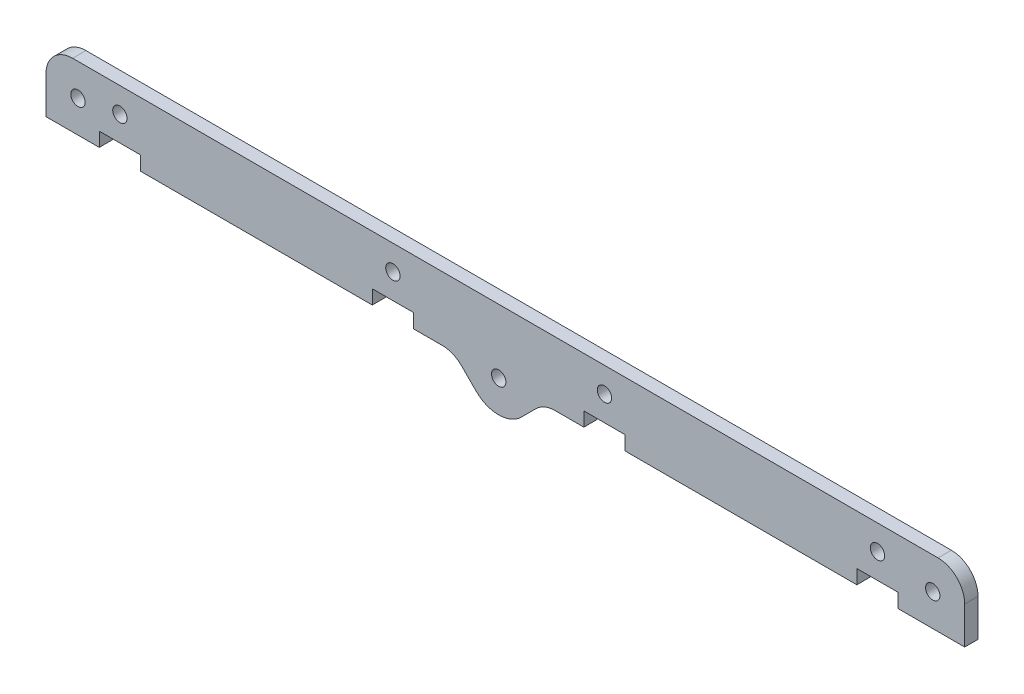
ISO-10303-21;
HEADER;
FILE_DESCRIPTION(('STEP AP214'),'2;1');
FILE_NAME('part.step','',(''),(''),'','','');
FILE_SCHEMA(('AUTOMOTIVE_DESIGN { 1 0 10303 214 1 1 1 1 }'));
ENDSEC;
DATA;
#1=APPLICATION_CONTEXT('core data for automotive mechanical design processes');
#2=APPLICATION_PROTOCOL_DEFINITION('international standard','automotive_design',2000,#1);
#3=PRODUCT_CONTEXT('',#1,'mechanical');
#4=PRODUCT('Part','Part','',(#3));
#5=PRODUCT_RELATED_PRODUCT_CATEGORY('part','',(#4));
#6=PRODUCT_DEFINITION_FORMATION('','',#4);
#7=PRODUCT_DEFINITION_CONTEXT('part definition',#1,'design');
#8=PRODUCT_DEFINITION('design','',#6,#7);
#9=PRODUCT_DEFINITION_SHAPE('','',#8);
#10=(LENGTH_UNIT() NAMED_UNIT(*) SI_UNIT(.MILLI.,.METRE.));
#11=(NAMED_UNIT(*) PLANE_ANGLE_UNIT() SI_UNIT($,.RADIAN.));
#12=(NAMED_UNIT(*) SI_UNIT($,.STERADIAN.) SOLID_ANGLE_UNIT());
#13=UNCERTAINTY_MEASURE_WITH_UNIT(LENGTH_MEASURE(1.E-05),#10,'distance_accuracy_value','');
#14=(GEOMETRIC_REPRESENTATION_CONTEXT(3) GLOBAL_UNCERTAINTY_ASSIGNED_CONTEXT((#13)) GLOBAL_UNIT_ASSIGNED_CONTEXT((#10,
#11,#12)) REPRESENTATION_CONTEXT('',''));
#15=CARTESIAN_POINT('',(0.,0.,0.));
#16=DIRECTION('',(0.,0.,1.));
#17=DIRECTION('',(1.,0.,0.));
#18=AXIS2_PLACEMENT_3D('',#15,#16,#17);
#19=CARTESIAN_POINT('',(170.,3.96817995129695E-13,5.));
#20=DIRECTION('',(0.,0.,1.));
#21=DIRECTION('',(1.,0.,0.));
#22=AXIS2_PLACEMENT_3D('',#19,#20,#21);
#23=PLANE('',#22);
#24=CARTESIAN_POINT('',(209.720562748476,14.65,5.));
#25=DIRECTION('',(0.,0.,1.));
#26=DIRECTION('',(1.,0.,0.));
#27=AXIS2_PLACEMENT_3D('',#24,#25,#26);
#28=CIRCLE('',#27,2.70000000000001);
#29=CARTESIAN_POINT('',(212.420562748476,14.65,5.));
#30=VERTEX_POINT('',#29);
#31=EDGE_CURVE('E946',#30,#30,#28,.T.);
#32=ORIENTED_EDGE('',*,*,#31,.F.);
#33=EDGE_LOOP('',(#32));
#34=FACE_BOUND('',#33,.T.);
#35=CARTESIAN_POINT('',(27.75,14.65,5.));
#36=DIRECTION('',(0.,0.,1.));
#37=DIRECTION('',(1.,0.,0.));
#38=AXIS2_PLACEMENT_3D('',#35,#36,#37);
#39=CIRCLE('',#38,2.70000000000001);
#40=CARTESIAN_POINT('',(30.45,14.65,5.));
#41=VERTEX_POINT('',#40);
#42=EDGE_CURVE('E931',#41,#41,#39,.T.);
#43=ORIENTED_EDGE('',*,*,#42,.F.);
#44=EDGE_LOOP('',(#43));
#45=FACE_BOUND('',#44,.T.);
#46=CARTESIAN_POINT('',(12.,12.,5.));
#47=DIRECTION('',(0.,0.,1.));
#48=DIRECTION('',(1.,0.,0.));
#49=AXIS2_PLACEMENT_3D('',#46,#47,#48);
#50=CIRCLE('',#49,2.7);
#51=CARTESIAN_POINT('',(14.7,12.,5.));
#52=VERTEX_POINT('',#51);
#53=EDGE_CURVE('E914',#52,#52,#50,.T.);
#54=ORIENTED_EDGE('',*,*,#53,.F.);
#55=EDGE_LOOP('',(#54));
#56=FACE_BOUND('',#55,.T.);
#57=DIRECTION('',(0.,1.,0.));
#58=VECTOR('',#57,1.);
#59=CARTESIAN_POINT('',(345.,0.,5.));
#60=LINE('',#59,#58);
#61=CARTESIAN_POINT('',(345.,0.,5.));
#62=VERTEX_POINT('',#61);
#63=CARTESIAN_POINT('',(345.,14.,5.));
#64=VERTEX_POINT('',#63);
#65=EDGE_CURVE('E380',#62,#64,#60,.T.);
#66=ORIENTED_EDGE('',*,*,#65,.T.);
#67=CARTESIAN_POINT('',(335.,14.,5.));
#68=DIRECTION('',(0.,0.,1.));
#69=DIRECTION('',(1.,0.,0.));
#70=AXIS2_PLACEMENT_3D('',#67,#68,#69);
#71=CIRCLE('',#70,10.);
#72=CARTESIAN_POINT('',(335.,24.,5.));
#73=VERTEX_POINT('',#72);
#74=EDGE_CURVE('E292',#64,#73,#71,.T.);
#75=ORIENTED_EDGE('',*,*,#74,.T.);
#76=DIRECTION('',(-1.,0.,0.));
#77=VECTOR('',#76,1.);
#78=CARTESIAN_POINT('',(0.,24.,5.));
#79=LINE('',#78,#77);
#80=CARTESIAN_POINT('',(10.,24.,5.));
#81=VERTEX_POINT('',#80);
#82=EDGE_CURVE('E379',#73,#81,#79,.T.);
#83=ORIENTED_EDGE('',*,*,#82,.T.);
#84=CARTESIAN_POINT('',(10.,14.,5.));
#85=DIRECTION('',(0.,0.,1.));
#86=DIRECTION('',(1.,0.,0.));
#87=AXIS2_PLACEMENT_3D('',#84,#85,#86);
#88=CIRCLE('',#87,10.);
#89=CARTESIAN_POINT('',(0.,14.,5.));
#90=VERTEX_POINT('',#89);
#91=EDGE_CURVE('E240',#81,#90,#88,.T.);
#92=ORIENTED_EDGE('',*,*,#91,.T.);
#93=DIRECTION('',(0.,-1.,0.));
#94=VECTOR('',#93,1.);
#95=CARTESIAN_POINT('',(0.,0.,5.));
#96=LINE('',#95,#94);
#97=CARTESIAN_POINT('',(0.,0.,5.));
#98=VERTEX_POINT('',#97);
#99=EDGE_CURVE('E229',#90,#98,#96,.T.);
#100=ORIENTED_EDGE('',*,*,#99,.T.);
#101=DIRECTION('',(1.,0.,0.));
#102=VECTOR('',#101,1.);
#103=CARTESIAN_POINT('',(0.,0.,5.));
#104=LINE('',#103,#102);
#105=CARTESIAN_POINT('',(20.,0.,5.));
#106=VERTEX_POINT('',#105);
#107=EDGE_CURVE('E235',#98,#106,#104,.T.);
#108=ORIENTED_EDGE('',*,*,#107,.T.);
#109=DIRECTION('',(0.,1.,0.));
#110=VECTOR('',#109,1.);
#111=CARTESIAN_POINT('',(20.,0.,5.));
#112=LINE('',#111,#110);
#113=CARTESIAN_POINT('',(20.,5.3,5.));
#114=VERTEX_POINT('',#113);
#115=EDGE_CURVE('E251',#106,#114,#112,.T.);
#116=ORIENTED_EDGE('',*,*,#115,.T.);
#117=DIRECTION('',(1.,0.,0.));
#118=VECTOR('',#117,1.);
#119=CARTESIAN_POINT('',(35.5,5.3,5.));
#120=LINE('',#119,#118);
#121=CARTESIAN_POINT('',(35.5,5.3,5.));
#122=VERTEX_POINT('',#121);
#123=EDGE_CURVE('E525',#114,#122,#120,.T.);
#124=ORIENTED_EDGE('',*,*,#123,.T.);
#125=DIRECTION('',(0.,-1.,0.));
#126=VECTOR('',#125,1.);
#127=CARTESIAN_POINT('',(35.5,0.,5.));
#128=LINE('',#127,#126);
#129=CARTESIAN_POINT('',(35.5,0.,5.));
#130=VERTEX_POINT('',#129);
#131=EDGE_CURVE('E541',#122,#130,#128,.T.);
#132=ORIENTED_EDGE('',*,*,#131,.T.);
#133=DIRECTION('',(1.,0.,0.));
#134=VECTOR('',#133,1.);
#135=CARTESIAN_POINT('',(35.5,0.,5.));
#136=LINE('',#135,#134);
#137=CARTESIAN_POINT('',(122.529437251524,0.,5.));
#138=VERTEX_POINT('',#137);
#139=EDGE_CURVE('E540',#130,#138,#136,.T.);
#140=ORIENTED_EDGE('',*,*,#139,.T.);
#141=DIRECTION('',(0.,1.,0.));
#142=VECTOR('',#141,1.);
#143=CARTESIAN_POINT('',(122.529437251524,0.,5.));
#144=LINE('',#143,#142);
#145=CARTESIAN_POINT('',(122.529437251524,5.3,5.));
#146=VERTEX_POINT('',#145);
#147=EDGE_CURVE('E539',#138,#146,#144,.T.);
#148=ORIENTED_EDGE('',*,*,#147,.T.);
#149=DIRECTION('',(1.,0.,0.));
#150=VECTOR('',#149,1.);
#151=CARTESIAN_POINT('',(138.029437251524,5.3,5.));
#152=LINE('',#151,#150);
#153=CARTESIAN_POINT('',(138.029437251524,5.3,5.));
#154=VERTEX_POINT('',#153);
#155=EDGE_CURVE('E544',#146,#154,#152,.T.);
#156=ORIENTED_EDGE('',*,*,#155,.T.);
#157=DIRECTION('',(0.,-1.,0.));
#158=VECTOR('',#157,1.);
#159=CARTESIAN_POINT('',(138.029437251524,0.,5.));
#160=LINE('',#159,#158);
#161=CARTESIAN_POINT('',(138.029437251524,0.,5.));
#162=VERTEX_POINT('',#161);
#163=EDGE_CURVE('E345',#154,#162,#160,.T.);
#164=ORIENTED_EDGE('',*,*,#163,.T.);
#165=DIRECTION('',(1.,0.,0.));
#166=VECTOR('',#165,1.);
#167=CARTESIAN_POINT('',(138.029437251524,0.,5.));
#168=LINE('',#167,#166);
#169=CARTESIAN_POINT('',(148.887301627793,0.,5.));
#170=VERTEX_POINT('',#169);
#171=EDGE_CURVE('E340',#162,#170,#168,.T.);
#172=ORIENTED_EDGE('',*,*,#171,.T.);
#173=CARTESIAN_POINT('',(148.887301627793,-10.,5.));
#174=DIRECTION('',(0.,0.,1.));
#175=DIRECTION('',(1.,0.,0.));
#176=AXIS2_PLACEMENT_3D('',#173,#174,#175);
#177=CIRCLE('',#176,10.);
#178=CARTESIAN_POINT('',(155.958369439658,-2.92893218813445,5.));
#179=VERTEX_POINT('',#178);
#180=EDGE_CURVE('E11',#170,#179,#177,.F.);
#181=ORIENTED_EDGE('',*,*,#180,.T.);
#182=DIRECTION('',(0.707106781186554,-0.707106781186541,0.));
#183=VECTOR('',#182,1.);
#184=CARTESIAN_POINT('',(161.514718625762,-8.48528137423799,5.));
#185=LINE('',#184,#183);
#186=CARTESIAN_POINT('',(161.514718625762,-8.48528137423799,5.));
#187=VERTEX_POINT('',#186);
#188=EDGE_CURVE('E335',#179,#187,#185,.T.);
#189=ORIENTED_EDGE('',*,*,#188,.T.);
#190=CARTESIAN_POINT('',(170.,3.96817995129695E-13,5.));
#191=DIRECTION('',(0.,0.,1.));
#192=DIRECTION('',(1.,0.,0.));
#193=AXIS2_PLACEMENT_3D('',#190,#191,#192);
#194=CIRCLE('',#193,11.9999999999996);
#195=CARTESIAN_POINT('',(178.485281374238,-8.48528137423789,5.));
#196=VERTEX_POINT('',#195);
#197=EDGE_CURVE('E338',#187,#196,#194,.T.);
#198=ORIENTED_EDGE('',*,*,#197,.T.);
#199=DIRECTION('',(0.707106781186547,0.707106781186548,0.));
#200=VECTOR('',#199,1.);
#201=CARTESIAN_POINT('',(178.485281374238,-8.48528137423788,5.));
#202=LINE('',#201,#200);
#203=CARTESIAN_POINT('',(184.041630560342,-2.92893218813453,5.));
#204=VERTEX_POINT('',#203);
#205=EDGE_CURVE('E344',#196,#204,#202,.T.);
#206=ORIENTED_EDGE('',*,*,#205,.T.);
#207=CARTESIAN_POINT('',(191.112698372207,-10.,5.));
#208=DIRECTION('',(0.,0.,1.));
#209=DIRECTION('',(1.,0.,0.));
#210=AXIS2_PLACEMENT_3D('',#207,#208,#209);
#211=CIRCLE('',#210,10.);
#212=CARTESIAN_POINT('',(191.112698372207,0.,5.));
#213=VERTEX_POINT('',#212);
#214=EDGE_CURVE('E308',#204,#213,#211,.F.);
#215=ORIENTED_EDGE('',*,*,#214,.T.);
#216=DIRECTION('',(1.,0.,0.));
#217=VECTOR('',#216,1.);
#218=CARTESIAN_POINT('',(186.970562748476,0.,5.));
#219=LINE('',#218,#217);
#220=CARTESIAN_POINT('',(201.970562748476,0.,5.));
#221=VERTEX_POINT('',#220);
#222=EDGE_CURVE('E348',#213,#221,#219,.T.);
#223=ORIENTED_EDGE('',*,*,#222,.T.);
#224=DIRECTION('',(0.,1.,0.));
#225=VECTOR('',#224,1.);
#226=CARTESIAN_POINT('',(201.970562748476,0.,5.));
#227=LINE('',#226,#225);
#228=CARTESIAN_POINT('',(201.970562748476,5.3,5.));
#229=VERTEX_POINT('',#228);
#230=EDGE_CURVE('E351',#221,#229,#227,.T.);
#231=ORIENTED_EDGE('',*,*,#230,.T.);
#232=DIRECTION('',(1.,0.,0.));
#233=VECTOR('',#232,1.);
#234=CARTESIAN_POINT('',(201.970562748476,5.3,5.));
#235=LINE('',#234,#233);
#236=CARTESIAN_POINT('',(217.470562748476,5.3,5.));
#237=VERTEX_POINT('',#236);
#238=EDGE_CURVE('E359',#229,#237,#235,.T.);
#239=ORIENTED_EDGE('',*,*,#238,.T.);
#240=DIRECTION('',(0.,-1.,0.));
#241=VECTOR('',#240,1.);
#242=CARTESIAN_POINT('',(217.470562748476,0.,5.));
#243=LINE('',#242,#241);
#244=CARTESIAN_POINT('',(217.470562748476,0.,5.));
#245=VERTEX_POINT('',#244);
#246=EDGE_CURVE('E358',#237,#245,#243,.T.);
#247=ORIENTED_EDGE('',*,*,#246,.T.);
#248=DIRECTION('',(1.,0.,0.));
#249=VECTOR('',#248,1.);
#250=CARTESIAN_POINT('',(217.470562748476,0.,5.));
#251=LINE('',#250,#249);
#252=CARTESIAN_POINT('',(304.5,0.,5.));
#253=VERTEX_POINT('',#252);
#254=EDGE_CURVE('E362',#245,#253,#251,.T.);
#255=ORIENTED_EDGE('',*,*,#254,.T.);
#256=DIRECTION('',(0.,1.,0.));
#257=VECTOR('',#256,1.);
#258=CARTESIAN_POINT('',(304.5,0.,5.));
#259=LINE('',#258,#257);
#260=CARTESIAN_POINT('',(304.5,5.3,5.));
#261=VERTEX_POINT('',#260);
#262=EDGE_CURVE('E364',#253,#261,#259,.T.);
#263=ORIENTED_EDGE('',*,*,#262,.T.);
#264=DIRECTION('',(1.,0.,0.));
#265=VECTOR('',#264,1.);
#266=CARTESIAN_POINT('',(304.5,5.3,5.));
#267=LINE('',#266,#265);
#268=CARTESIAN_POINT('',(320.,5.30000000000001,5.));
#269=VERTEX_POINT('',#268);
#270=EDGE_CURVE('E366',#261,#269,#267,.T.);
#271=ORIENTED_EDGE('',*,*,#270,.T.);
#272=DIRECTION('',(0.,-1.,0.));
#273=VECTOR('',#272,1.);
#274=CARTESIAN_POINT('',(320.,0.,5.));
#275=LINE('',#274,#273);
#276=CARTESIAN_POINT('',(320.,0.,5.));
#277=VERTEX_POINT('',#276);
#278=EDGE_CURVE('E371',#269,#277,#275,.T.);
#279=ORIENTED_EDGE('',*,*,#278,.T.);
#280=DIRECTION('',(1.,0.,0.));
#281=VECTOR('',#280,1.);
#282=CARTESIAN_POINT('',(320.,0.,5.));
#283=LINE('',#282,#281);
#284=EDGE_CURVE('E372',#277,#62,#283,.T.);
#285=ORIENTED_EDGE('',*,*,#284,.T.);
#286=EDGE_LOOP('',(#66,#75,#83,#92,#100,#108,#116,#124,#132,#140,#148,#156,#164,#172,#181,#189,
#198,#206,#215,#223,#231,#239,#247,#255,#263,#271,#279,#285));
#287=FACE_BOUND('',#286,.T.);
#288=CARTESIAN_POINT('',(170.,3.96817995129695E-13,5.));
#289=DIRECTION('',(0.,0.,1.));
#290=DIRECTION('',(1.,0.,0.));
#291=AXIS2_PLACEMENT_3D('',#288,#289,#290);
#292=CIRCLE('',#291,2.70000000000001);
#293=CARTESIAN_POINT('',(172.7,3.96817995129695E-13,5.));
#294=VERTEX_POINT('',#293);
#295=EDGE_CURVE('E390',#294,#294,#292,.T.);
#296=ORIENTED_EDGE('',*,*,#295,.F.);
#297=EDGE_LOOP('',(#296));
#298=FACE_BOUND('',#297,.T.);
#299=CARTESIAN_POINT('',(333.,12.,5.));
#300=DIRECTION('',(0.,0.,1.));
#301=DIRECTION('',(1.,0.,0.));
#302=AXIS2_PLACEMENT_3D('',#299,#300,#301);
#303=CIRCLE('',#302,2.69999999999996);
#304=CARTESIAN_POINT('',(335.7,12.,5.));
#305=VERTEX_POINT('',#304);
#306=EDGE_CURVE('E923',#305,#305,#303,.T.);
#307=ORIENTED_EDGE('',*,*,#306,.F.);
#308=EDGE_LOOP('',(#307));
#309=FACE_BOUND('',#308,.T.);
#310=CARTESIAN_POINT('',(130.279437251524,14.65,5.));
#311=DIRECTION('',(0.,0.,1.));
#312=DIRECTION('',(1.,0.,0.));
#313=AXIS2_PLACEMENT_3D('',#310,#311,#312);
#314=CIRCLE('',#313,2.70000000000001);
#315=CARTESIAN_POINT('',(132.979437251524,14.65,5.));
#316=VERTEX_POINT('',#315);
#317=EDGE_CURVE('E936',#316,#316,#314,.T.);
#318=ORIENTED_EDGE('',*,*,#317,.F.);
#319=EDGE_LOOP('',(#318));
#320=FACE_BOUND('',#319,.T.);
#321=CARTESIAN_POINT('',(312.25,14.65,5.));
#322=DIRECTION('',(0.,0.,1.));
#323=DIRECTION('',(1.,0.,0.));
#324=AXIS2_PLACEMENT_3D('',#321,#322,#323);
#325=CIRCLE('',#324,2.69999999999996);
#326=CARTESIAN_POINT('',(314.95,14.65,5.));
#327=VERTEX_POINT('',#326);
#328=EDGE_CURVE('E953',#327,#327,#325,.T.);
#329=ORIENTED_EDGE('',*,*,#328,.F.);
#330=EDGE_LOOP('',(#329));
#331=FACE_BOUND('',#330,.T.);
#332=ADVANCED_FACE('F44',(#34,#45,#56,#287,#298,#309,#320,#331),#23,.T.);
#333=CARTESIAN_POINT('',(170.,3.96817995129695E-13,0.));
#334=DIRECTION('',(0.,0.,1.));
#335=DIRECTION('',(1.,0.,0.));
#336=AXIS2_PLACEMENT_3D('',#333,#334,#335);
#337=PLANE('',#336);
#338=DIRECTION('',(-1.,0.,0.));
#339=VECTOR('',#338,1.);
#340=CARTESIAN_POINT('',(0.,24.,0.));
#341=LINE('',#340,#339);
#342=CARTESIAN_POINT('',(335.,24.,0.));
#343=VERTEX_POINT('',#342);
#344=CARTESIAN_POINT('',(10.,24.,0.));
#345=VERTEX_POINT('',#344);
#346=EDGE_CURVE('E241',#343,#345,#341,.T.);
#347=ORIENTED_EDGE('',*,*,#346,.F.);
#348=CARTESIAN_POINT('',(335.,14.,0.));
#349=DIRECTION('',(0.,0.,1.));
#350=DIRECTION('',(1.,0.,0.));
#351=AXIS2_PLACEMENT_3D('',#348,#349,#350);
#352=CIRCLE('',#351,10.);
#353=CARTESIAN_POINT('',(345.,14.,0.));
#354=VERTEX_POINT('',#353);
#355=EDGE_CURVE('E281',#343,#354,#352,.F.);
#356=ORIENTED_EDGE('',*,*,#355,.T.);
#357=DIRECTION('',(0.,1.,0.));
#358=VECTOR('',#357,1.);
#359=CARTESIAN_POINT('',(345.,0.,0.));
#360=LINE('',#359,#358);
#361=CARTESIAN_POINT('',(345.,0.,0.));
#362=VERTEX_POINT('',#361);
#363=EDGE_CURVE('E448',#362,#354,#360,.T.);
#364=ORIENTED_EDGE('',*,*,#363,.F.);
#365=DIRECTION('',(1.,0.,0.));
#366=VECTOR('',#365,1.);
#367=CARTESIAN_POINT('',(320.,0.,0.));
#368=LINE('',#367,#366);
#369=CARTESIAN_POINT('',(320.,0.,0.));
#370=VERTEX_POINT('',#369);
#371=EDGE_CURVE('E444',#370,#362,#368,.T.);
#372=ORIENTED_EDGE('',*,*,#371,.F.);
#373=DIRECTION('',(0.,-1.,0.));
#374=VECTOR('',#373,1.);
#375=CARTESIAN_POINT('',(320.,0.,0.));
#376=LINE('',#375,#374);
#377=CARTESIAN_POINT('',(320.,5.30000000000001,0.));
#378=VERTEX_POINT('',#377);
#379=EDGE_CURVE('E439',#378,#370,#376,.T.);
#380=ORIENTED_EDGE('',*,*,#379,.F.);
#381=DIRECTION('',(1.,0.,0.));
#382=VECTOR('',#381,1.);
#383=CARTESIAN_POINT('',(304.5,5.3,0.));
#384=LINE('',#383,#382);
#385=CARTESIAN_POINT('',(304.5,5.3,0.));
#386=VERTEX_POINT('',#385);
#387=EDGE_CURVE('E440',#386,#378,#384,.T.);
#388=ORIENTED_EDGE('',*,*,#387,.F.);
#389=DIRECTION('',(0.,1.,0.));
#390=VECTOR('',#389,1.);
#391=CARTESIAN_POINT('',(304.5,0.,0.));
#392=LINE('',#391,#390);
#393=CARTESIAN_POINT('',(304.5,0.,0.));
#394=VERTEX_POINT('',#393);
#395=EDGE_CURVE('E432',#394,#386,#392,.T.);
#396=ORIENTED_EDGE('',*,*,#395,.F.);
#397=DIRECTION('',(1.,0.,0.));
#398=VECTOR('',#397,1.);
#399=CARTESIAN_POINT('',(217.470562748476,0.,0.));
#400=LINE('',#399,#398);
#401=CARTESIAN_POINT('',(217.470562748476,0.,0.));
#402=VERTEX_POINT('',#401);
#403=EDGE_CURVE('E431',#402,#394,#400,.T.);
#404=ORIENTED_EDGE('',*,*,#403,.F.);
#405=DIRECTION('',(0.,-1.,0.));
#406=VECTOR('',#405,1.);
#407=CARTESIAN_POINT('',(217.470562748476,0.,0.));
#408=LINE('',#407,#406);
#409=CARTESIAN_POINT('',(217.470562748476,5.3,0.));
#410=VERTEX_POINT('',#409);
#411=EDGE_CURVE('E428',#410,#402,#408,.T.);
#412=ORIENTED_EDGE('',*,*,#411,.F.);
#413=DIRECTION('',(1.,0.,0.));
#414=VECTOR('',#413,1.);
#415=CARTESIAN_POINT('',(201.970562748476,5.3,0.));
#416=LINE('',#415,#414);
#417=CARTESIAN_POINT('',(201.970562748476,5.3,0.));
#418=VERTEX_POINT('',#417);
#419=EDGE_CURVE('E422',#418,#410,#416,.T.);
#420=ORIENTED_EDGE('',*,*,#419,.F.);
#421=DIRECTION('',(0.,1.,0.));
#422=VECTOR('',#421,1.);
#423=CARTESIAN_POINT('',(201.970562748476,0.,0.));
#424=LINE('',#423,#422);
#425=CARTESIAN_POINT('',(201.970562748476,0.,0.));
#426=VERTEX_POINT('',#425);
#427=EDGE_CURVE('E425',#426,#418,#424,.T.);
#428=ORIENTED_EDGE('',*,*,#427,.F.);
#429=DIRECTION('',(1.,0.,0.));
#430=VECTOR('',#429,1.);
#431=CARTESIAN_POINT('',(186.970562748476,0.,0.));
#432=LINE('',#431,#430);
#433=CARTESIAN_POINT('',(191.112698372207,0.,0.));
#434=VERTEX_POINT('',#433);
#435=EDGE_CURVE('E420',#434,#426,#432,.T.);
#436=ORIENTED_EDGE('',*,*,#435,.F.);
#437=CARTESIAN_POINT('',(191.112698372207,-10.,0.));
#438=DIRECTION('',(0.,0.,1.));
#439=DIRECTION('',(1.,0.,0.));
#440=AXIS2_PLACEMENT_3D('',#437,#438,#439);
#441=CIRCLE('',#440,10.);
#442=CARTESIAN_POINT('',(184.041630560342,-2.92893218813453,0.));
#443=VERTEX_POINT('',#442);
#444=EDGE_CURVE('E305',#434,#443,#441,.T.);
#445=ORIENTED_EDGE('',*,*,#444,.T.);
#446=DIRECTION('',(0.707106781186547,0.707106781186548,0.));
#447=VECTOR('',#446,1.);
#448=CARTESIAN_POINT('',(178.485281374238,-8.48528137423788,0.));
#449=LINE('',#448,#447);
#450=CARTESIAN_POINT('',(178.485281374238,-8.48528137423789,0.));
#451=VERTEX_POINT('',#450);
#452=EDGE_CURVE('E412',#451,#443,#449,.T.);
#453=ORIENTED_EDGE('',*,*,#452,.F.);
#454=CARTESIAN_POINT('',(170.,3.96817995129695E-13,0.));
#455=DIRECTION('',(0.,0.,1.));
#456=DIRECTION('',(1.,0.,0.));
#457=AXIS2_PLACEMENT_3D('',#454,#455,#456);
#458=CIRCLE('',#457,11.9999999999996);
#459=CARTESIAN_POINT('',(161.514718625762,-8.48528137423799,0.));
#460=VERTEX_POINT('',#459);
#461=EDGE_CURVE('E411',#460,#451,#458,.T.);
#462=ORIENTED_EDGE('',*,*,#461,.F.);
#463=DIRECTION('',(0.707106781186554,-0.707106781186541,0.));
#464=VECTOR('',#463,1.);
#465=CARTESIAN_POINT('',(161.514718625762,-8.48528137423799,0.));
#466=LINE('',#465,#464);
#467=CARTESIAN_POINT('',(155.958369439658,-2.92893218813445,0.));
#468=VERTEX_POINT('',#467);
#469=EDGE_CURVE('E318',#468,#460,#466,.T.);
#470=ORIENTED_EDGE('',*,*,#469,.F.);
#471=CARTESIAN_POINT('',(148.887301627793,-10.,0.));
#472=DIRECTION('',(0.,0.,1.));
#473=DIRECTION('',(1.,0.,0.));
#474=AXIS2_PLACEMENT_3D('',#471,#472,#473);
#475=CIRCLE('',#474,10.);
#476=CARTESIAN_POINT('',(148.887301627793,0.,0.));
#477=VERTEX_POINT('',#476);
#478=EDGE_CURVE('E53',#468,#477,#475,.T.);
#479=ORIENTED_EDGE('',*,*,#478,.T.);
#480=DIRECTION('',(1.,0.,0.));
#481=VECTOR('',#480,1.);
#482=CARTESIAN_POINT('',(138.029437251524,0.,0.));
#483=LINE('',#482,#481);
#484=CARTESIAN_POINT('',(138.029437251524,0.,0.));
#485=VERTEX_POINT('',#484);
#486=EDGE_CURVE('E316',#485,#477,#483,.T.);
#487=ORIENTED_EDGE('',*,*,#486,.F.);
#488=DIRECTION('',(0.,-1.,0.));
#489=VECTOR('',#488,1.);
#490=CARTESIAN_POINT('',(138.029437251524,0.,0.));
#491=LINE('',#490,#489);
#492=CARTESIAN_POINT('',(138.029437251524,5.3,0.));
#493=VERTEX_POINT('',#492);
#494=EDGE_CURVE('E326',#493,#485,#491,.T.);
#495=ORIENTED_EDGE('',*,*,#494,.F.);
#496=DIRECTION('',(1.,0.,0.));
#497=VECTOR('',#496,1.);
#498=CARTESIAN_POINT('',(138.029437251524,5.3,0.));
#499=LINE('',#498,#497);
#500=CARTESIAN_POINT('',(122.529437251524,5.3,0.));
#501=VERTEX_POINT('',#500);
#502=EDGE_CURVE('E403',#501,#493,#499,.T.);
#503=ORIENTED_EDGE('',*,*,#502,.F.);
#504=DIRECTION('',(0.,1.,0.));
#505=VECTOR('',#504,1.);
#506=CARTESIAN_POINT('',(122.529437251524,0.,0.));
#507=LINE('',#506,#505);
#508=CARTESIAN_POINT('',(122.529437251524,0.,0.));
#509=VERTEX_POINT('',#508);
#510=EDGE_CURVE('E405',#509,#501,#507,.T.);
#511=ORIENTED_EDGE('',*,*,#510,.F.);
#512=DIRECTION('',(1.,0.,0.));
#513=VECTOR('',#512,1.);
#514=CARTESIAN_POINT('',(35.5,0.,0.));
#515=LINE('',#514,#513);
#516=CARTESIAN_POINT('',(35.5,0.,0.));
#517=VERTEX_POINT('',#516);
#518=EDGE_CURVE('E398',#517,#509,#515,.T.);
#519=ORIENTED_EDGE('',*,*,#518,.F.);
#520=DIRECTION('',(0.,-1.,0.));
#521=VECTOR('',#520,1.);
#522=CARTESIAN_POINT('',(35.5,0.,0.));
#523=LINE('',#522,#521);
#524=CARTESIAN_POINT('',(35.5,5.3,0.));
#525=VERTEX_POINT('',#524);
#526=EDGE_CURVE('E399',#525,#517,#523,.T.);
#527=ORIENTED_EDGE('',*,*,#526,.F.);
#528=DIRECTION('',(1.,0.,0.));
#529=VECTOR('',#528,1.);
#530=CARTESIAN_POINT('',(35.5,5.3,0.));
#531=LINE('',#530,#529);
#532=CARTESIAN_POINT('',(20.,5.3,0.));
#533=VERTEX_POINT('',#532);
#534=EDGE_CURVE('E391',#533,#525,#531,.T.);
#535=ORIENTED_EDGE('',*,*,#534,.F.);
#536=DIRECTION('',(0.,1.,0.));
#537=VECTOR('',#536,1.);
#538=CARTESIAN_POINT('',(20.,0.,0.));
#539=LINE('',#538,#537);
#540=CARTESIAN_POINT('',(20.,0.,0.));
#541=VERTEX_POINT('',#540);
#542=EDGE_CURVE('E388',#541,#533,#539,.T.);
#543=ORIENTED_EDGE('',*,*,#542,.F.);
#544=DIRECTION('',(1.,0.,0.));
#545=VECTOR('',#544,1.);
#546=CARTESIAN_POINT('',(0.,0.,0.));
#547=LINE('',#546,#545);
#548=CARTESIAN_POINT('',(0.,0.,0.));
#549=VERTEX_POINT('',#548);
#550=EDGE_CURVE('E387',#549,#541,#547,.T.);
#551=ORIENTED_EDGE('',*,*,#550,.F.);
#552=DIRECTION('',(0.,-1.,0.));
#553=VECTOR('',#552,1.);
#554=CARTESIAN_POINT('',(0.,0.,0.));
#555=LINE('',#554,#553);
#556=CARTESIAN_POINT('',(0.,14.,0.));
#557=VERTEX_POINT('',#556);
#558=EDGE_CURVE('E260',#557,#549,#555,.T.);
#559=ORIENTED_EDGE('',*,*,#558,.F.);
#560=CARTESIAN_POINT('',(10.,14.,0.));
#561=DIRECTION('',(0.,0.,1.));
#562=DIRECTION('',(1.,0.,0.));
#563=AXIS2_PLACEMENT_3D('',#560,#561,#562);
#564=CIRCLE('',#563,10.);
#565=EDGE_CURVE('E278',#557,#345,#564,.F.);
#566=ORIENTED_EDGE('',*,*,#565,.T.);
#567=EDGE_LOOP('',(#347,#356,#364,#372,#380,#388,#396,#404,#412,#420,#428,#436,#445,#453,#462,
#470,#479,#487,#495,#503,#511,#519,#527,#535,#543,#551,#559,#566));
#568=FACE_BOUND('',#567,.T.);
#569=CARTESIAN_POINT('',(170.,3.96817995129695E-13,0.));
#570=DIRECTION('',(0.,0.,1.));
#571=DIRECTION('',(1.,0.,0.));
#572=AXIS2_PLACEMENT_3D('',#569,#570,#571);
#573=CIRCLE('',#572,2.70000000000001);
#574=CARTESIAN_POINT('',(172.7,3.96817995129695E-13,0.));
#575=VERTEX_POINT('',#574);
#576=EDGE_CURVE('E913',#575,#575,#573,.T.);
#577=ORIENTED_EDGE('',*,*,#576,.T.);
#578=EDGE_LOOP('',(#577));
#579=FACE_BOUND('',#578,.T.);
#580=CARTESIAN_POINT('',(12.,12.,0.));
#581=DIRECTION('',(0.,0.,1.));
#582=DIRECTION('',(1.,0.,0.));
#583=AXIS2_PLACEMENT_3D('',#580,#581,#582);
#584=CIRCLE('',#583,2.7);
#585=CARTESIAN_POINT('',(14.7,12.,0.));
#586=VERTEX_POINT('',#585);
#587=EDGE_CURVE('E919',#586,#586,#584,.T.);
#588=ORIENTED_EDGE('',*,*,#587,.T.);
#589=EDGE_LOOP('',(#588));
#590=FACE_BOUND('',#589,.T.);
#591=CARTESIAN_POINT('',(333.,12.,0.));
#592=DIRECTION('',(0.,0.,1.));
#593=DIRECTION('',(1.,0.,0.));
#594=AXIS2_PLACEMENT_3D('',#591,#592,#593);
#595=CIRCLE('',#594,2.69999999999996);
#596=CARTESIAN_POINT('',(335.7,12.,0.));
#597=VERTEX_POINT('',#596);
#598=EDGE_CURVE('E930',#597,#597,#595,.T.);
#599=ORIENTED_EDGE('',*,*,#598,.T.);
#600=EDGE_LOOP('',(#599));
#601=FACE_BOUND('',#600,.T.);
#602=CARTESIAN_POINT('',(27.75,14.65,0.));
#603=DIRECTION('',(0.,0.,1.));
#604=DIRECTION('',(1.,0.,0.));
#605=AXIS2_PLACEMENT_3D('',#602,#603,#604);
#606=CIRCLE('',#605,2.70000000000001);
#607=CARTESIAN_POINT('',(30.45,14.65,0.));
#608=VERTEX_POINT('',#607);
#609=EDGE_CURVE('E934',#608,#608,#606,.T.);
#610=ORIENTED_EDGE('',*,*,#609,.T.);
#611=EDGE_LOOP('',(#610));
#612=FACE_BOUND('',#611,.T.);
#613=CARTESIAN_POINT('',(130.279437251524,14.65,0.));
#614=DIRECTION('',(0.,0.,1.));
#615=DIRECTION('',(1.,0.,0.));
#616=AXIS2_PLACEMENT_3D('',#613,#614,#615);
#617=CIRCLE('',#616,2.70000000000001);
#618=CARTESIAN_POINT('',(132.979437251524,14.65,0.));
#619=VERTEX_POINT('',#618);
#620=EDGE_CURVE('E941',#619,#619,#617,.T.);
#621=ORIENTED_EDGE('',*,*,#620,.T.);
#622=EDGE_LOOP('',(#621));
#623=FACE_BOUND('',#622,.T.);
#624=CARTESIAN_POINT('',(209.720562748476,14.65,0.));
#625=DIRECTION('',(0.,0.,1.));
#626=DIRECTION('',(1.,0.,0.));
#627=AXIS2_PLACEMENT_3D('',#624,#625,#626);
#628=CIRCLE('',#627,2.70000000000001);
#629=CARTESIAN_POINT('',(212.420562748476,14.65,0.));
#630=VERTEX_POINT('',#629);
#631=EDGE_CURVE('E952',#630,#630,#628,.T.);
#632=ORIENTED_EDGE('',*,*,#631,.T.);
#633=EDGE_LOOP('',(#632));
#634=FACE_BOUND('',#633,.T.);
#635=CARTESIAN_POINT('',(312.25,14.65,0.));
#636=DIRECTION('',(0.,0.,1.));
#637=DIRECTION('',(1.,0.,0.));
#638=AXIS2_PLACEMENT_3D('',#635,#636,#637);
#639=CIRCLE('',#638,2.69999999999996);
#640=CARTESIAN_POINT('',(314.95,14.65,0.));
#641=VERTEX_POINT('',#640);
#642=EDGE_CURVE('E959',#641,#641,#639,.T.);
#643=ORIENTED_EDGE('',*,*,#642,.T.);
#644=EDGE_LOOP('',(#643));
#645=FACE_BOUND('',#644,.T.);
#646=ADVANCED_FACE('F311',(#568,#579,#590,#601,#612,#623,#634,#645),#337,.F.);
#647=CARTESIAN_POINT('',(0.,0.,5.));
#648=DIRECTION('',(1.,0.,0.));
#649=DIRECTION('',(0.,0.,-1.));
#650=AXIS2_PLACEMENT_3D('',#647,#648,#649);
#651=PLANE('',#650);
#652=ORIENTED_EDGE('',*,*,#99,.F.);
#653=DIRECTION('',(0.,0.,-1.));
#654=VECTOR('',#653,1.);
#655=CARTESIAN_POINT('',(0.,14.,5.));
#656=LINE('',#655,#654);
#657=EDGE_CURVE('E294',#90,#557,#656,.T.);
#658=ORIENTED_EDGE('',*,*,#657,.T.);
#659=ORIENTED_EDGE('',*,*,#558,.T.);
#660=DIRECTION('',(0.,0.,-1.));
#661=VECTOR('',#660,1.);
#662=CARTESIAN_POINT('',(0.,0.,5.));
#663=LINE('',#662,#661);
#664=EDGE_CURVE('E250',#98,#549,#663,.T.);
#665=ORIENTED_EDGE('',*,*,#664,.F.);
#666=EDGE_LOOP('',(#652,#658,#659,#665));
#667=FACE_BOUND('',#666,.T.);
#668=ADVANCED_FACE('F254',(#667),#651,.F.);
#669=CARTESIAN_POINT('',(0.,0.,5.));
#670=DIRECTION('',(0.,1.,0.));
#671=DIRECTION('',(0.,0.,1.));
#672=AXIS2_PLACEMENT_3D('',#669,#670,#671);
#673=PLANE('',#672);
#674=ORIENTED_EDGE('',*,*,#550,.T.);
#675=DIRECTION('',(0.,0.,-1.));
#676=VECTOR('',#675,1.);
#677=CARTESIAN_POINT('',(20.,0.,5.));
#678=LINE('',#677,#676);
#679=EDGE_CURVE('E247',#106,#541,#678,.T.);
#680=ORIENTED_EDGE('',*,*,#679,.F.);
#681=ORIENTED_EDGE('',*,*,#107,.F.);
#682=ORIENTED_EDGE('',*,*,#664,.T.);
#683=EDGE_LOOP('',(#674,#680,#681,#682));
#684=FACE_BOUND('',#683,.T.);
#685=ADVANCED_FACE('F246',(#684),#673,.F.);
#686=CARTESIAN_POINT('',(20.,0.,5.));
#687=DIRECTION('',(-1.,0.,0.));
#688=DIRECTION('',(0.,-1.,0.));
#689=AXIS2_PLACEMENT_3D('',#686,#687,#688);
#690=PLANE('',#689);
#691=ORIENTED_EDGE('',*,*,#542,.T.);
#692=DIRECTION('',(0.,0.,-1.));
#693=VECTOR('',#692,1.);
#694=CARTESIAN_POINT('',(20.,5.3,5.));
#695=LINE('',#694,#693);
#696=EDGE_CURVE('E270',#114,#533,#695,.T.);
#697=ORIENTED_EDGE('',*,*,#696,.F.);
#698=ORIENTED_EDGE('',*,*,#115,.F.);
#699=ORIENTED_EDGE('',*,*,#679,.T.);
#700=EDGE_LOOP('',(#691,#697,#698,#699));
#701=FACE_BOUND('',#700,.T.);
#702=ADVANCED_FACE('F803',(#701),#690,.F.);
#703=CARTESIAN_POINT('',(35.5,5.3,5.));
#704=DIRECTION('',(0.,1.,0.));
#705=DIRECTION('',(-1.,0.,0.));
#706=AXIS2_PLACEMENT_3D('',#703,#704,#705);
#707=PLANE('',#706);
#708=ORIENTED_EDGE('',*,*,#534,.T.);
#709=DIRECTION('',(0.,0.,-1.));
#710=VECTOR('',#709,1.);
#711=CARTESIAN_POINT('',(35.5,5.3,5.));
#712=LINE('',#711,#710);
#713=EDGE_CURVE('E515',#122,#525,#712,.T.);
#714=ORIENTED_EDGE('',*,*,#713,.F.);
#715=ORIENTED_EDGE('',*,*,#123,.F.);
#716=ORIENTED_EDGE('',*,*,#696,.T.);
#717=EDGE_LOOP('',(#708,#714,#715,#716));
#718=FACE_BOUND('',#717,.T.);
#719=ADVANCED_FACE('F524',(#718),#707,.F.);
#720=CARTESIAN_POINT('',(35.5,0.,5.));
#721=DIRECTION('',(1.,0.,0.));
#722=DIRECTION('',(0.,0.,-1.));
#723=AXIS2_PLACEMENT_3D('',#720,#721,#722);
#724=PLANE('',#723);
#725=ORIENTED_EDGE('',*,*,#526,.T.);
#726=DIRECTION('',(0.,0.,-1.));
#727=VECTOR('',#726,1.);
#728=CARTESIAN_POINT('',(35.5,0.,5.));
#729=LINE('',#728,#727);
#730=EDGE_CURVE('E510',#130,#517,#729,.T.);
#731=ORIENTED_EDGE('',*,*,#730,.F.);
#732=ORIENTED_EDGE('',*,*,#131,.F.);
#733=ORIENTED_EDGE('',*,*,#713,.T.);
#734=EDGE_LOOP('',(#725,#731,#732,#733));
#735=FACE_BOUND('',#734,.T.);
#736=ADVANCED_FACE('F533',(#735),#724,.F.);
#737=CARTESIAN_POINT('',(35.5,0.,5.));
#738=DIRECTION('',(0.,1.,0.));
#739=DIRECTION('',(-1.,0.,0.));
#740=AXIS2_PLACEMENT_3D('',#737,#738,#739);
#741=PLANE('',#740);
#742=ORIENTED_EDGE('',*,*,#518,.T.);
#743=DIRECTION('',(0.,0.,-1.));
#744=VECTOR('',#743,1.);
#745=CARTESIAN_POINT('',(122.529437251524,0.,5.));
#746=LINE('',#745,#744);
#747=EDGE_CURVE('E504',#138,#509,#746,.T.);
#748=ORIENTED_EDGE('',*,*,#747,.F.);
#749=ORIENTED_EDGE('',*,*,#139,.F.);
#750=ORIENTED_EDGE('',*,*,#730,.T.);
#751=EDGE_LOOP('',(#742,#748,#749,#750));
#752=FACE_BOUND('',#751,.T.);
#753=ADVANCED_FACE('F532',(#752),#741,.F.);
#754=CARTESIAN_POINT('',(122.529437251524,0.,5.));
#755=DIRECTION('',(-1.,0.,0.));
#756=DIRECTION('',(0.,0.,1.));
#757=AXIS2_PLACEMENT_3D('',#754,#755,#756);
#758=PLANE('',#757);
#759=ORIENTED_EDGE('',*,*,#510,.T.);
#760=DIRECTION('',(0.,0.,-1.));
#761=VECTOR('',#760,1.);
#762=CARTESIAN_POINT('',(122.529437251524,5.3,5.));
#763=LINE('',#762,#761);
#764=EDGE_CURVE('E498',#146,#501,#763,.T.);
#765=ORIENTED_EDGE('',*,*,#764,.F.);
#766=ORIENTED_EDGE('',*,*,#147,.F.);
#767=ORIENTED_EDGE('',*,*,#747,.T.);
#768=EDGE_LOOP('',(#759,#765,#766,#767));
#769=FACE_BOUND('',#768,.T.);
#770=ADVANCED_FACE('F561',(#769),#758,.F.);
#771=CARTESIAN_POINT('',(138.029437251524,5.3,5.));
#772=DIRECTION('',(0.,1.,0.));
#773=DIRECTION('',(0.,0.,1.));
#774=AXIS2_PLACEMENT_3D('',#771,#772,#773);
#775=PLANE('',#774);
#776=ORIENTED_EDGE('',*,*,#502,.T.);
#777=DIRECTION('',(0.,0.,-1.));
#778=VECTOR('',#777,1.);
#779=CARTESIAN_POINT('',(138.029437251524,5.3,5.));
#780=LINE('',#779,#778);
#781=EDGE_CURVE('E497',#154,#493,#780,.T.);
#782=ORIENTED_EDGE('',*,*,#781,.F.);
#783=ORIENTED_EDGE('',*,*,#155,.F.);
#784=ORIENTED_EDGE('',*,*,#764,.T.);
#785=EDGE_LOOP('',(#776,#782,#783,#784));
#786=FACE_BOUND('',#785,.T.);
#787=ADVANCED_FACE('F559',(#786),#775,.F.);
#788=CARTESIAN_POINT('',(138.029437251524,0.,5.));
#789=DIRECTION('',(1.,0.,0.));
#790=DIRECTION('',(0.,0.,-1.));
#791=AXIS2_PLACEMENT_3D('',#788,#789,#790);
#792=PLANE('',#791);
#793=ORIENTED_EDGE('',*,*,#494,.T.);
#794=DIRECTION('',(0.,0.,-1.));
#795=VECTOR('',#794,1.);
#796=CARTESIAN_POINT('',(138.029437251524,0.,5.));
#797=LINE('',#796,#795);
#798=EDGE_CURVE('E322',#162,#485,#797,.T.);
#799=ORIENTED_EDGE('',*,*,#798,.F.);
#800=ORIENTED_EDGE('',*,*,#163,.F.);
#801=ORIENTED_EDGE('',*,*,#781,.T.);
#802=EDGE_LOOP('',(#793,#799,#800,#801));
#803=FACE_BOUND('',#802,.T.);
#804=ADVANCED_FACE('F558',(#803),#792,.F.);
#805=CARTESIAN_POINT('',(138.029437251524,0.,5.));
#806=DIRECTION('',(0.,1.,0.));
#807=DIRECTION('',(0.,0.,1.));
#808=AXIS2_PLACEMENT_3D('',#805,#806,#807);
#809=PLANE('',#808);
#810=ORIENTED_EDGE('',*,*,#486,.T.);
#811=DIRECTION('',(0.,0.,-1.));
#812=VECTOR('',#811,1.);
#813=CARTESIAN_POINT('',(148.887301627793,0.,5.));
#814=LINE('',#813,#812);
#815=EDGE_CURVE('E66',#477,#170,#814,.F.);
#816=ORIENTED_EDGE('',*,*,#815,.T.);
#817=ORIENTED_EDGE('',*,*,#171,.F.);
#818=ORIENTED_EDGE('',*,*,#798,.T.);
#819=EDGE_LOOP('',(#810,#816,#817,#818));
#820=FACE_BOUND('',#819,.T.);
#821=ADVANCED_FACE('F325',(#820),#809,.F.);
#822=CARTESIAN_POINT('',(161.514718625762,-8.48528137423799,5.));
#823=DIRECTION('',(0.707106781186541,0.707106781186554,0.));
#824=DIRECTION('',(-0.707106781186554,0.707106781186541,0.));
#825=AXIS2_PLACEMENT_3D('',#822,#823,#824);
#826=PLANE('',#825);
#827=ORIENTED_EDGE('',*,*,#188,.F.);
#828=DIRECTION('',(0.,0.,-1.));
#829=VECTOR('',#828,1.);
#830=CARTESIAN_POINT('',(155.958369439658,-2.92893218813445,0.));
#831=LINE('',#830,#829);
#832=EDGE_CURVE('E300',#179,#468,#831,.T.);
#833=ORIENTED_EDGE('',*,*,#832,.T.);
#834=ORIENTED_EDGE('',*,*,#469,.T.);
#835=DIRECTION('',(0.,0.,-1.));
#836=VECTOR('',#835,1.);
#837=CARTESIAN_POINT('',(161.514718625762,-8.48528137423799,5.));
#838=LINE('',#837,#836);
#839=EDGE_CURVE('E334',#187,#460,#838,.T.);
#840=ORIENTED_EDGE('',*,*,#839,.F.);
#841=EDGE_LOOP('',(#827,#833,#834,#840));
#842=FACE_BOUND('',#841,.T.);
#843=ADVANCED_FACE('F328',(#842),#826,.F.);
#844=CARTESIAN_POINT('',(170.,3.96817995129695E-13,5.));
#845=DIRECTION('',(0.,0.,-1.));
#846=DIRECTION('',(-1.,0.,0.));
#847=AXIS2_PLACEMENT_3D('',#844,#845,#846);
#848=CYLINDRICAL_SURFACE('',#847,11.9999999999996);
#849=ORIENTED_EDGE('',*,*,#461,.T.);
#850=DIRECTION('',(0.,0.,-1.));
#851=VECTOR('',#850,1.);
#852=CARTESIAN_POINT('',(178.485281374238,-8.48528137423789,5.));
#853=LINE('',#852,#851);
#854=EDGE_CURVE('E488',#196,#451,#853,.T.);
#855=ORIENTED_EDGE('',*,*,#854,.F.);
#856=ORIENTED_EDGE('',*,*,#197,.F.);
#857=ORIENTED_EDGE('',*,*,#839,.T.);
#858=EDGE_LOOP('',(#849,#855,#856,#857));
#859=FACE_BOUND('',#858,.T.);
#860=ADVANCED_FACE('F631',(#859),#848,.T.);
#861=CARTESIAN_POINT('',(178.485281374238,-8.48528137423788,5.));
#862=DIRECTION('',(-0.707106781186548,0.707106781186547,0.));
#863=DIRECTION('',(-0.707106781186547,-0.707106781186548,0.));
#864=AXIS2_PLACEMENT_3D('',#861,#862,#863);
#865=PLANE('',#864);
#866=ORIENTED_EDGE('',*,*,#452,.T.);
#867=DIRECTION('',(0.,0.,-1.));
#868=VECTOR('',#867,1.);
#869=CARTESIAN_POINT('',(184.041630560342,-2.92893218813453,5.));
#870=LINE('',#869,#868);
#871=EDGE_CURVE('E264',#443,#204,#870,.F.);
#872=ORIENTED_EDGE('',*,*,#871,.T.);
#873=ORIENTED_EDGE('',*,*,#205,.F.);
#874=ORIENTED_EDGE('',*,*,#854,.T.);
#875=EDGE_LOOP('',(#866,#872,#873,#874));
#876=FACE_BOUND('',#875,.T.);
#877=ADVANCED_FACE('F626',(#876),#865,.F.);
#878=CARTESIAN_POINT('',(186.970562748476,0.,5.));
#879=DIRECTION('',(0.,1.,0.));
#880=DIRECTION('',(0.,0.,1.));
#881=AXIS2_PLACEMENT_3D('',#878,#879,#880);
#882=PLANE('',#881);
#883=ORIENTED_EDGE('',*,*,#222,.F.);
#884=DIRECTION('',(0.,0.,-1.));
#885=VECTOR('',#884,1.);
#886=CARTESIAN_POINT('',(191.112698372207,0.,0.));
#887=LINE('',#886,#885);
#888=EDGE_CURVE('E257',#213,#434,#887,.T.);
#889=ORIENTED_EDGE('',*,*,#888,.T.);
#890=ORIENTED_EDGE('',*,*,#435,.T.);
#891=DIRECTION('',(0.,0.,-1.));
#892=VECTOR('',#891,1.);
#893=CARTESIAN_POINT('',(201.970562748476,0.,5.));
#894=LINE('',#893,#892);
#895=EDGE_CURVE('E482',#221,#426,#894,.T.);
#896=ORIENTED_EDGE('',*,*,#895,.F.);
#897=EDGE_LOOP('',(#883,#889,#890,#896));
#898=FACE_BOUND('',#897,.T.);
#899=ADVANCED_FACE('F624',(#898),#882,.F.);
#900=CARTESIAN_POINT('',(201.970562748476,0.,5.));
#901=DIRECTION('',(-1.,0.,0.));
#902=DIRECTION('',(0.,0.,1.));
#903=AXIS2_PLACEMENT_3D('',#900,#901,#902);
#904=PLANE('',#903);
#905=ORIENTED_EDGE('',*,*,#427,.T.);
#906=DIRECTION('',(0.,0.,-1.));
#907=VECTOR('',#906,1.);
#908=CARTESIAN_POINT('',(201.970562748476,5.3,5.));
#909=LINE('',#908,#907);
#910=EDGE_CURVE('E477',#229,#418,#909,.T.);
#911=ORIENTED_EDGE('',*,*,#910,.F.);
#912=ORIENTED_EDGE('',*,*,#230,.F.);
#913=ORIENTED_EDGE('',*,*,#895,.T.);
#914=EDGE_LOOP('',(#905,#911,#912,#913));
#915=FACE_BOUND('',#914,.T.);
#916=ADVANCED_FACE('F617',(#915),#904,.F.);
#917=CARTESIAN_POINT('',(201.970562748476,5.3,5.));
#918=DIRECTION('',(0.,1.,0.));
#919=DIRECTION('',(0.,0.,1.));
#920=AXIS2_PLACEMENT_3D('',#917,#918,#919);
#921=PLANE('',#920);
#922=ORIENTED_EDGE('',*,*,#419,.T.);
#923=DIRECTION('',(0.,0.,-1.));
#924=VECTOR('',#923,1.);
#925=CARTESIAN_POINT('',(217.470562748476,5.3,5.));
#926=LINE('',#925,#924);
#927=EDGE_CURVE('E478',#237,#410,#926,.T.);
#928=ORIENTED_EDGE('',*,*,#927,.F.);
#929=ORIENTED_EDGE('',*,*,#238,.F.);
#930=ORIENTED_EDGE('',*,*,#910,.T.);
#931=EDGE_LOOP('',(#922,#928,#929,#930));
#932=FACE_BOUND('',#931,.T.);
#933=ADVANCED_FACE('F619',(#932),#921,.F.);
#934=CARTESIAN_POINT('',(217.470562748476,0.,5.));
#935=DIRECTION('',(1.,0.,0.));
#936=DIRECTION('',(0.,0.,-1.));
#937=AXIS2_PLACEMENT_3D('',#934,#935,#936);
#938=PLANE('',#937);
#939=ORIENTED_EDGE('',*,*,#411,.T.);
#940=DIRECTION('',(0.,0.,-1.));
#941=VECTOR('',#940,1.);
#942=CARTESIAN_POINT('',(217.470562748476,0.,5.));
#943=LINE('',#942,#941);
#944=EDGE_CURVE('E472',#245,#402,#943,.T.);
#945=ORIENTED_EDGE('',*,*,#944,.F.);
#946=ORIENTED_EDGE('',*,*,#246,.F.);
#947=ORIENTED_EDGE('',*,*,#927,.T.);
#948=EDGE_LOOP('',(#939,#945,#946,#947));
#949=FACE_BOUND('',#948,.T.);
#950=ADVANCED_FACE('F615',(#949),#938,.F.);
#951=CARTESIAN_POINT('',(217.470562748476,0.,5.));
#952=DIRECTION('',(0.,1.,0.));
#953=DIRECTION('',(0.,0.,1.));
#954=AXIS2_PLACEMENT_3D('',#951,#952,#953);
#955=PLANE('',#954);
#956=ORIENTED_EDGE('',*,*,#403,.T.);
#957=DIRECTION('',(0.,0.,-1.));
#958=VECTOR('',#957,1.);
#959=CARTESIAN_POINT('',(304.5,0.,5.));
#960=LINE('',#959,#958);
#961=EDGE_CURVE('E470',#253,#394,#960,.T.);
#962=ORIENTED_EDGE('',*,*,#961,.F.);
#963=ORIENTED_EDGE('',*,*,#254,.F.);
#964=ORIENTED_EDGE('',*,*,#944,.T.);
#965=EDGE_LOOP('',(#956,#962,#963,#964));
#966=FACE_BOUND('',#965,.T.);
#967=ADVANCED_FACE('F609',(#966),#955,.F.);
#968=CARTESIAN_POINT('',(304.5,0.,5.));
#969=DIRECTION('',(-1.,0.,0.));
#970=DIRECTION('',(0.,0.,1.));
#971=AXIS2_PLACEMENT_3D('',#968,#969,#970);
#972=PLANE('',#971);
#973=ORIENTED_EDGE('',*,*,#395,.T.);
#974=DIRECTION('',(0.,0.,-1.));
#975=VECTOR('',#974,1.);
#976=CARTESIAN_POINT('',(304.5,5.3,5.));
#977=LINE('',#976,#975);
#978=EDGE_CURVE('E464',#261,#386,#977,.T.);
#979=ORIENTED_EDGE('',*,*,#978,.F.);
#980=ORIENTED_EDGE('',*,*,#262,.F.);
#981=ORIENTED_EDGE('',*,*,#961,.T.);
#982=EDGE_LOOP('',(#973,#979,#980,#981));
#983=FACE_BOUND('',#982,.T.);
#984=ADVANCED_FACE('F603',(#983),#972,.F.);
#985=CARTESIAN_POINT('',(304.5,5.3,5.));
#986=DIRECTION('',(0.,1.,0.));
#987=DIRECTION('',(-1.,0.,0.));
#988=AXIS2_PLACEMENT_3D('',#985,#986,#987);
#989=PLANE('',#988);
#990=ORIENTED_EDGE('',*,*,#387,.T.);
#991=DIRECTION('',(0.,0.,-1.));
#992=VECTOR('',#991,1.);
#993=CARTESIAN_POINT('',(320.,5.30000000000001,5.));
#994=LINE('',#993,#992);
#995=EDGE_CURVE('E458',#269,#378,#994,.T.);
#996=ORIENTED_EDGE('',*,*,#995,.F.);
#997=ORIENTED_EDGE('',*,*,#270,.F.);
#998=ORIENTED_EDGE('',*,*,#978,.T.);
#999=EDGE_LOOP('',(#990,#996,#997,#998));
#1000=FACE_BOUND('',#999,.T.);
#1001=ADVANCED_FACE('F599',(#1000),#989,.F.);
#1002=CARTESIAN_POINT('',(320.,0.,5.));
#1003=DIRECTION('',(1.,0.,0.));
#1004=DIRECTION('',(0.,0.,-1.));
#1005=AXIS2_PLACEMENT_3D('',#1002,#1003,#1004);
#1006=PLANE('',#1005);
#1007=ORIENTED_EDGE('',*,*,#379,.T.);
#1008=DIRECTION('',(0.,0.,-1.));
#1009=VECTOR('',#1008,1.);
#1010=CARTESIAN_POINT('',(320.,0.,5.));
#1011=LINE('',#1010,#1009);
#1012=EDGE_CURVE('E457',#277,#370,#1011,.T.);
#1013=ORIENTED_EDGE('',*,*,#1012,.F.);
#1014=ORIENTED_EDGE('',*,*,#278,.F.);
#1015=ORIENTED_EDGE('',*,*,#995,.T.);
#1016=EDGE_LOOP('',(#1007,#1013,#1014,#1015));
#1017=FACE_BOUND('',#1016,.T.);
#1018=ADVANCED_FACE('F596',(#1017),#1006,.F.);
#1019=CARTESIAN_POINT('',(320.,0.,5.));
#1020=DIRECTION('',(0.,1.,0.));
#1021=DIRECTION('',(0.,0.,1.));
#1022=AXIS2_PLACEMENT_3D('',#1019,#1020,#1021);
#1023=PLANE('',#1022);
#1024=ORIENTED_EDGE('',*,*,#371,.T.);
#1025=DIRECTION('',(0.,0.,-1.));
#1026=VECTOR('',#1025,1.);
#1027=CARTESIAN_POINT('',(345.,0.,5.));
#1028=LINE('',#1027,#1026);
#1029=EDGE_CURVE('E382',#62,#362,#1028,.T.);
#1030=ORIENTED_EDGE('',*,*,#1029,.F.);
#1031=ORIENTED_EDGE('',*,*,#284,.F.);
#1032=ORIENTED_EDGE('',*,*,#1012,.T.);
#1033=EDGE_LOOP('',(#1024,#1030,#1031,#1032));
#1034=FACE_BOUND('',#1033,.T.);
#1035=ADVANCED_FACE('F595',(#1034),#1023,.F.);
#1036=CARTESIAN_POINT('',(345.,0.,5.));
#1037=DIRECTION('',(-1.,0.,0.));
#1038=DIRECTION('',(0.,0.,1.));
#1039=AXIS2_PLACEMENT_3D('',#1036,#1037,#1038);
#1040=PLANE('',#1039);
#1041=ORIENTED_EDGE('',*,*,#363,.T.);
#1042=DIRECTION('',(0.,0.,-1.));
#1043=VECTOR('',#1042,1.);
#1044=CARTESIAN_POINT('',(345.,14.,5.));
#1045=LINE('',#1044,#1043);
#1046=EDGE_CURVE('E289',#354,#64,#1045,.F.);
#1047=ORIENTED_EDGE('',*,*,#1046,.T.);
#1048=ORIENTED_EDGE('',*,*,#65,.F.);
#1049=ORIENTED_EDGE('',*,*,#1029,.T.);
#1050=EDGE_LOOP('',(#1041,#1047,#1048,#1049));
#1051=FACE_BOUND('',#1050,.T.);
#1052=ADVANCED_FACE('F586',(#1051),#1040,.F.);
#1053=CARTESIAN_POINT('',(0.,24.,5.));
#1054=DIRECTION('',(0.,-1.,0.));
#1055=DIRECTION('',(0.,0.,-1.));
#1056=AXIS2_PLACEMENT_3D('',#1053,#1054,#1055);
#1057=PLANE('',#1056);
#1058=ORIENTED_EDGE('',*,*,#82,.F.);
#1059=DIRECTION('',(0.,0.,-1.));
#1060=VECTOR('',#1059,1.);
#1061=CARTESIAN_POINT('',(335.,24.,5.));
#1062=LINE('',#1061,#1060);
#1063=EDGE_CURVE('E277',#73,#343,#1062,.T.);
#1064=ORIENTED_EDGE('',*,*,#1063,.T.);
#1065=ORIENTED_EDGE('',*,*,#346,.T.);
#1066=DIRECTION('',(0.,0.,-1.));
#1067=VECTOR('',#1066,1.);
#1068=CARTESIAN_POINT('',(10.,24.,5.));
#1069=LINE('',#1068,#1067);
#1070=EDGE_CURVE('E272',#345,#81,#1069,.F.);
#1071=ORIENTED_EDGE('',*,*,#1070,.T.);
#1072=EDGE_LOOP('',(#1058,#1064,#1065,#1071));
#1073=FACE_BOUND('',#1072,.T.);
#1074=ADVANCED_FACE('F584',(#1073),#1057,.F.);
#1075=CARTESIAN_POINT('',(170.,3.96817995129695E-13,5.));
#1076=DIRECTION('',(0.,0.,-1.));
#1077=DIRECTION('',(-1.,0.,0.));
#1078=AXIS2_PLACEMENT_3D('',#1075,#1076,#1077);
#1079=CYLINDRICAL_SURFACE('',#1078,2.70000000000001);
#1080=ORIENTED_EDGE('',*,*,#295,.T.);
#1081=EDGE_LOOP('',(#1080));
#1082=FACE_BOUND('',#1081,.T.);
#1083=ORIENTED_EDGE('',*,*,#576,.F.);
#1084=EDGE_LOOP('',(#1083));
#1085=FACE_BOUND('',#1084,.T.);
#1086=ADVANCED_FACE('F582',(#1082,#1085),#1079,.F.);
#1087=CARTESIAN_POINT('',(12.,12.,5.));
#1088=DIRECTION('',(0.,0.,-1.));
#1089=DIRECTION('',(-1.,0.,0.));
#1090=AXIS2_PLACEMENT_3D('',#1087,#1088,#1089);
#1091=CYLINDRICAL_SURFACE('',#1090,2.7);
#1092=ORIENTED_EDGE('',*,*,#53,.T.);
#1093=EDGE_LOOP('',(#1092));
#1094=FACE_BOUND('',#1093,.T.);
#1095=ORIENTED_EDGE('',*,*,#587,.F.);
#1096=EDGE_LOOP('',(#1095));
#1097=FACE_BOUND('',#1096,.T.);
#1098=ADVANCED_FACE('F703',(#1094,#1097),#1091,.F.);
#1099=CARTESIAN_POINT('',(333.,12.,5.));
#1100=DIRECTION('',(0.,0.,-1.));
#1101=DIRECTION('',(-1.,0.,0.));
#1102=AXIS2_PLACEMENT_3D('',#1099,#1100,#1101);
#1103=CYLINDRICAL_SURFACE('',#1102,2.69999999999996);
#1104=ORIENTED_EDGE('',*,*,#306,.T.);
#1105=EDGE_LOOP('',(#1104));
#1106=FACE_BOUND('',#1105,.T.);
#1107=ORIENTED_EDGE('',*,*,#598,.F.);
#1108=EDGE_LOOP('',(#1107));
#1109=FACE_BOUND('',#1108,.T.);
#1110=ADVANCED_FACE('F715',(#1106,#1109),#1103,.F.);
#1111=CARTESIAN_POINT('',(27.75,14.65,5.));
#1112=DIRECTION('',(0.,0.,-1.));
#1113=DIRECTION('',(-1.,0.,0.));
#1114=AXIS2_PLACEMENT_3D('',#1111,#1112,#1113);
#1115=CYLINDRICAL_SURFACE('',#1114,2.70000000000001);
#1116=ORIENTED_EDGE('',*,*,#42,.T.);
#1117=EDGE_LOOP('',(#1116));
#1118=FACE_BOUND('',#1117,.T.);
#1119=ORIENTED_EDGE('',*,*,#609,.F.);
#1120=EDGE_LOOP('',(#1119));
#1121=FACE_BOUND('',#1120,.T.);
#1122=ADVANCED_FACE('F718',(#1118,#1121),#1115,.F.);
#1123=CARTESIAN_POINT('',(130.279437251524,14.65,5.));
#1124=DIRECTION('',(0.,0.,-1.));
#1125=DIRECTION('',(-1.,0.,0.));
#1126=AXIS2_PLACEMENT_3D('',#1123,#1124,#1125);
#1127=CYLINDRICAL_SURFACE('',#1126,2.70000000000001);
#1128=ORIENTED_EDGE('',*,*,#317,.T.);
#1129=EDGE_LOOP('',(#1128));
#1130=FACE_BOUND('',#1129,.T.);
#1131=ORIENTED_EDGE('',*,*,#620,.F.);
#1132=EDGE_LOOP('',(#1131));
#1133=FACE_BOUND('',#1132,.T.);
#1134=ADVANCED_FACE('F728',(#1130,#1133),#1127,.F.);
#1135=CARTESIAN_POINT('',(209.720562748476,14.65,5.));
#1136=DIRECTION('',(0.,0.,-1.));
#1137=DIRECTION('',(-1.,0.,0.));
#1138=AXIS2_PLACEMENT_3D('',#1135,#1136,#1137);
#1139=CYLINDRICAL_SURFACE('',#1138,2.70000000000001);
#1140=ORIENTED_EDGE('',*,*,#31,.T.);
#1141=EDGE_LOOP('',(#1140));
#1142=FACE_BOUND('',#1141,.T.);
#1143=ORIENTED_EDGE('',*,*,#631,.F.);
#1144=EDGE_LOOP('',(#1143));
#1145=FACE_BOUND('',#1144,.T.);
#1146=ADVANCED_FACE('F736',(#1142,#1145),#1139,.F.);
#1147=CARTESIAN_POINT('',(312.25,14.65,5.));
#1148=DIRECTION('',(0.,0.,-1.));
#1149=DIRECTION('',(-1.,0.,0.));
#1150=AXIS2_PLACEMENT_3D('',#1147,#1148,#1149);
#1151=CYLINDRICAL_SURFACE('',#1150,2.69999999999996);
#1152=ORIENTED_EDGE('',*,*,#328,.T.);
#1153=EDGE_LOOP('',(#1152));
#1154=FACE_BOUND('',#1153,.T.);
#1155=ORIENTED_EDGE('',*,*,#642,.F.);
#1156=EDGE_LOOP('',(#1155));
#1157=FACE_BOUND('',#1156,.T.);
#1158=ADVANCED_FACE('F748',(#1154,#1157),#1151,.F.);
#1159=CARTESIAN_POINT('',(191.112698372207,-10.,5.));
#1160=DIRECTION('',(0.,0.,1.));
#1161=DIRECTION('',(1.,0.,0.));
#1162=AXIS2_PLACEMENT_3D('',#1159,#1160,#1161);
#1163=CYLINDRICAL_SURFACE('',#1162,10.);
#1164=ORIENTED_EDGE('',*,*,#214,.F.);
#1165=ORIENTED_EDGE('',*,*,#871,.F.);
#1166=ORIENTED_EDGE('',*,*,#444,.F.);
#1167=ORIENTED_EDGE('',*,*,#888,.F.);
#1168=EDGE_LOOP('',(#1164,#1165,#1166,#1167));
#1169=FACE_BOUND('',#1168,.T.);
#1170=ADVANCED_FACE('F754',(#1169),#1163,.F.);
#1171=CARTESIAN_POINT('',(335.,14.,5.));
#1172=DIRECTION('',(0.,0.,-1.));
#1173=DIRECTION('',(-1.,0.,0.));
#1174=AXIS2_PLACEMENT_3D('',#1171,#1172,#1173);
#1175=CYLINDRICAL_SURFACE('',#1174,10.);
#1176=ORIENTED_EDGE('',*,*,#74,.F.);
#1177=ORIENTED_EDGE('',*,*,#1046,.F.);
#1178=ORIENTED_EDGE('',*,*,#355,.F.);
#1179=ORIENTED_EDGE('',*,*,#1063,.F.);
#1180=EDGE_LOOP('',(#1176,#1177,#1178,#1179));
#1181=FACE_BOUND('',#1180,.T.);
#1182=ADVANCED_FACE('F770',(#1181),#1175,.T.);
#1183=CARTESIAN_POINT('',(10.,14.,5.));
#1184=DIRECTION('',(0.,0.,-1.));
#1185=DIRECTION('',(-1.,0.,0.));
#1186=AXIS2_PLACEMENT_3D('',#1183,#1184,#1185);
#1187=CYLINDRICAL_SURFACE('',#1186,10.);
#1188=ORIENTED_EDGE('',*,*,#91,.F.);
#1189=ORIENTED_EDGE('',*,*,#1070,.F.);
#1190=ORIENTED_EDGE('',*,*,#565,.F.);
#1191=ORIENTED_EDGE('',*,*,#657,.F.);
#1192=EDGE_LOOP('',(#1188,#1189,#1190,#1191));
#1193=FACE_BOUND('',#1192,.T.);
#1194=ADVANCED_FACE('F780',(#1193),#1187,.T.);
#1195=CARTESIAN_POINT('',(148.887301627793,-10.,5.));
#1196=DIRECTION('',(0.,0.,1.));
#1197=DIRECTION('',(1.,0.,0.));
#1198=AXIS2_PLACEMENT_3D('',#1195,#1196,#1197);
#1199=CYLINDRICAL_SURFACE('',#1198,10.);
#1200=ORIENTED_EDGE('',*,*,#180,.F.);
#1201=ORIENTED_EDGE('',*,*,#815,.F.);
#1202=ORIENTED_EDGE('',*,*,#478,.F.);
#1203=ORIENTED_EDGE('',*,*,#832,.F.);
#1204=EDGE_LOOP('',(#1200,#1201,#1202,#1203));
#1205=FACE_BOUND('',#1204,.T.);
#1206=ADVANCED_FACE('F50',(#1205),#1199,.F.);
#1207=CLOSED_SHELL('',(#332,#646,#668,#685,#702,#719,#736,#753,#770,#787,#804,#821,#843,#860,
#877,#899,#916,#933,#950,#967,#984,#1001,#1018,#1035,#1052,#1074,#1086,#1098,#1110,#1122,#1134,
#1146,#1158,#1170,#1182,#1194,#1206));
#1208=MANIFOLD_SOLID_BREP('B2',#1207);
#1209=ADVANCED_BREP_SHAPE_REPRESENTATION('',(#18,#1208),#14);
#1210=SHAPE_DEFINITION_REPRESENTATION(#9,#1209);
ENDSEC;
END-ISO-10303-21;
